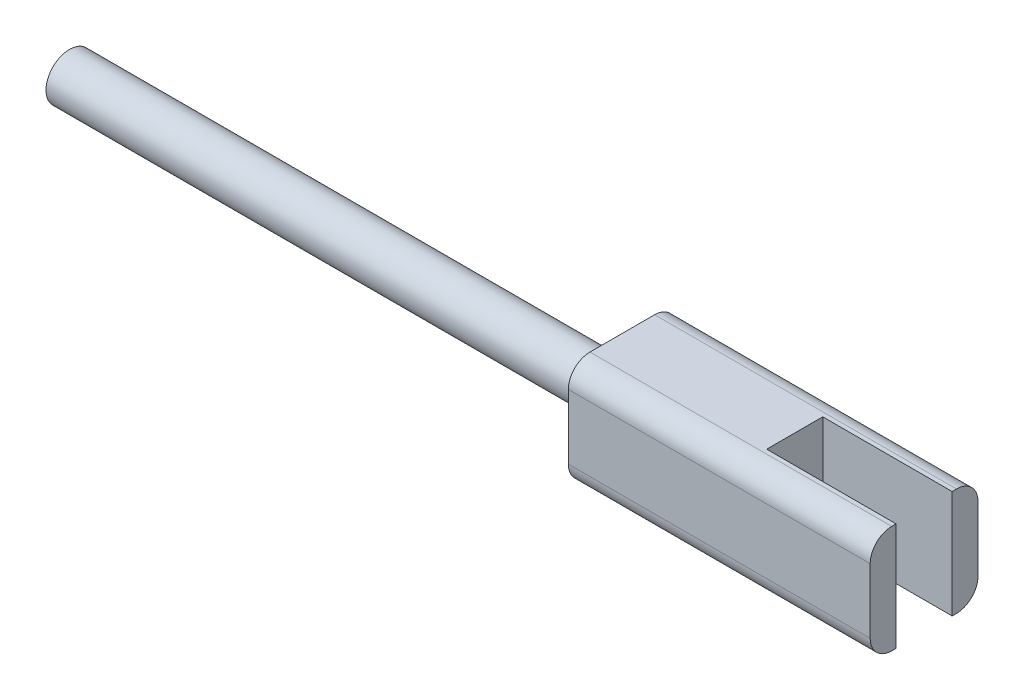
ISO-10303-21;
HEADER;
FILE_DESCRIPTION(('STEP AP214'),'2;1');
FILE_NAME('part.step','',(''),(''),'','','');
FILE_SCHEMA(('AUTOMOTIVE_DESIGN { 1 0 10303 214 1 1 1 1 }'));
ENDSEC;
DATA;
#1=APPLICATION_CONTEXT('core data for automotive mechanical design processes');
#2=APPLICATION_PROTOCOL_DEFINITION('international standard','automotive_design',2000,#1);
#3=PRODUCT_CONTEXT('',#1,'mechanical');
#4=PRODUCT('Part','Part','',(#3));
#5=PRODUCT_RELATED_PRODUCT_CATEGORY('part','',(#4));
#6=PRODUCT_DEFINITION_FORMATION('','',#4);
#7=PRODUCT_DEFINITION_CONTEXT('part definition',#1,'design');
#8=PRODUCT_DEFINITION('design','',#6,#7);
#9=PRODUCT_DEFINITION_SHAPE('','',#8);
#10=(LENGTH_UNIT() NAMED_UNIT(*) SI_UNIT(.MILLI.,.METRE.));
#11=(NAMED_UNIT(*) PLANE_ANGLE_UNIT() SI_UNIT($,.RADIAN.));
#12=(NAMED_UNIT(*) SI_UNIT($,.STERADIAN.) SOLID_ANGLE_UNIT());
#13=UNCERTAINTY_MEASURE_WITH_UNIT(LENGTH_MEASURE(1.E-05),#10,'distance_accuracy_value','');
#14=(GEOMETRIC_REPRESENTATION_CONTEXT(3) GLOBAL_UNCERTAINTY_ASSIGNED_CONTEXT((#13)) GLOBAL_UNIT_ASSIGNED_CONTEXT((#10,
#11,#12)) REPRESENTATION_CONTEXT('',''));
#15=CARTESIAN_POINT('',(0.,0.,0.));
#16=DIRECTION('',(0.,0.,1.));
#17=DIRECTION('',(1.,0.,0.));
#18=AXIS2_PLACEMENT_3D('',#15,#16,#17);
#19=CARTESIAN_POINT('',(39.637,-1.5,1.5));
#20=DIRECTION('',(1.,0.,0.));
#21=DIRECTION('',(0.,0.,-1.));
#22=AXIS2_PLACEMENT_3D('',#19,#20,#21);
#23=PLANE('',#22);
#24=DIRECTION('',(0.,1.,0.));
#25=VECTOR('',#24,1.);
#26=CARTESIAN_POINT('',(39.637,-1.5,-1.3));
#27=LINE('',#26,#25);
#28=CARTESIAN_POINT('',(39.637,-2.5,-1.3));
#29=VERTEX_POINT('',#28);
#30=CARTESIAN_POINT('',(39.637,2.5,-1.3));
#31=VERTEX_POINT('',#30);
#32=EDGE_CURVE('E11',#29,#31,#27,.T.);
#33=ORIENTED_EDGE('',*,*,#32,.F.);
#34=DIRECTION('',(0.,0.,-1.));
#35=VECTOR('',#34,1.);
#36=CARTESIAN_POINT('',(39.637,-2.5,1.5));
#37=LINE('',#36,#35);
#38=CARTESIAN_POINT('',(39.637,-2.5,-1.5));
#39=VERTEX_POINT('',#38);
#40=EDGE_CURVE('E202',#29,#39,#37,.T.);
#41=ORIENTED_EDGE('',*,*,#40,.T.);
#42=CARTESIAN_POINT('',(39.637,-1.5,-1.5));
#43=DIRECTION('',(1.,0.,0.));
#44=DIRECTION('',(0.,0.,-1.));
#45=AXIS2_PLACEMENT_3D('',#42,#43,#44);
#46=CIRCLE('',#45,1.);
#47=CARTESIAN_POINT('',(39.637,-1.5,-2.5));
#48=VERTEX_POINT('',#47);
#49=EDGE_CURVE('E201',#39,#48,#46,.T.);
#50=ORIENTED_EDGE('',*,*,#49,.T.);
#51=DIRECTION('',(0.,1.,0.));
#52=VECTOR('',#51,1.);
#53=CARTESIAN_POINT('',(39.637,-1.5,-2.5));
#54=LINE('',#53,#52);
#55=CARTESIAN_POINT('',(39.637,1.5,-2.5));
#56=VERTEX_POINT('',#55);
#57=EDGE_CURVE('E204',#48,#56,#54,.T.);
#58=ORIENTED_EDGE('',*,*,#57,.T.);
#59=CARTESIAN_POINT('',(39.637,1.5,-1.5));
#60=DIRECTION('',(1.,0.,0.));
#61=DIRECTION('',(0.,0.,-1.));
#62=AXIS2_PLACEMENT_3D('',#59,#60,#61);
#63=CIRCLE('',#62,1.);
#64=CARTESIAN_POINT('',(39.637,2.5,-1.5));
#65=VERTEX_POINT('',#64);
#66=EDGE_CURVE('E129',#56,#65,#63,.T.);
#67=ORIENTED_EDGE('',*,*,#66,.T.);
#68=DIRECTION('',(0.,0.,1.));
#69=VECTOR('',#68,1.);
#70=CARTESIAN_POINT('',(39.637,2.5,-1.5));
#71=LINE('',#70,#69);
#72=EDGE_CURVE('E128',#65,#31,#71,.T.);
#73=ORIENTED_EDGE('',*,*,#72,.T.);
#74=EDGE_LOOP('',(#33,#41,#50,#58,#67,#73));
#75=FACE_BOUND('',#74,.T.);
#76=ADVANCED_FACE('F39',(#75),#23,.T.);
#77=CARTESIAN_POINT('',(27.637,0.,0.));
#78=DIRECTION('',(-1.,0.,0.));
#79=DIRECTION('',(0.,0.,1.));
#80=AXIS2_PLACEMENT_3D('',#77,#78,#79);
#81=CYLINDRICAL_SURFACE('',#80,1.09);
#82=CARTESIAN_POINT('',(0.,0.,0.));
#83=DIRECTION('',(1.,0.,0.));
#84=DIRECTION('',(0.,0.,-1.));
#85=AXIS2_PLACEMENT_3D('',#82,#83,#84);
#86=CIRCLE('',#85,1.09);
#87=CARTESIAN_POINT('',(0.,0.,1.09));
#88=VERTEX_POINT('',#87);
#89=EDGE_CURVE('E181',#88,#88,#86,.T.);
#90=CARTESIAN_POINT('',(25.637,0.,0.));
#91=DIRECTION('',(1.,0.,0.));
#92=DIRECTION('',(0.,0.,-1.));
#93=AXIS2_PLACEMENT_3D('',#90,#91,#92);
#94=CIRCLE('',#93,1.09);
#95=CARTESIAN_POINT('',(25.637,0.,1.09));
#96=VERTEX_POINT('',#95);
#97=EDGE_CURVE('E184',#96,#96,#94,.T.);
#98=CARTESIAN_POINT('',(0.,0.,1.09));
#99=CARTESIAN_POINT('',(0.267052083333334,0.,1.09));
#100=CARTESIAN_POINT('',(0.534104166666667,0.,1.09));
#101=CARTESIAN_POINT('',(1.06820833333333,0.,1.09));
#102=CARTESIAN_POINT('',(1.33526041666667,0.,1.09));
#103=CARTESIAN_POINT('',(1.86936458333333,0.,1.09));
#104=CARTESIAN_POINT('',(2.13641666666667,0.,1.09));
#105=CARTESIAN_POINT('',(2.67052083333333,0.,1.09));
#106=CARTESIAN_POINT('',(2.93757291666667,0.,1.09));
#107=CARTESIAN_POINT('',(3.47167708333333,0.,1.09));
#108=CARTESIAN_POINT('',(3.73872916666667,0.,1.09));
#109=CARTESIAN_POINT('',(4.27283333333333,0.,1.09));
#110=CARTESIAN_POINT('',(4.53988541666667,0.,1.09));
#111=CARTESIAN_POINT('',(5.07398958333333,0.,1.09));
#112=CARTESIAN_POINT('',(5.34104166666667,0.,1.09));
#113=CARTESIAN_POINT('',(5.87514583333333,0.,1.09));
#114=CARTESIAN_POINT('',(6.14219791666667,0.,1.09));
#115=CARTESIAN_POINT('',(6.67630208333333,0.,1.09));
#116=CARTESIAN_POINT('',(6.94335416666667,0.,1.09));
#117=CARTESIAN_POINT('',(7.47745833333333,0.,1.09));
#118=CARTESIAN_POINT('',(7.74451041666667,0.,1.09));
#119=CARTESIAN_POINT('',(8.27861458333333,0.,1.09));
#120=CARTESIAN_POINT('',(8.54566666666667,0.,1.09));
#121=CARTESIAN_POINT('',(9.07977083333333,0.,1.09));
#122=CARTESIAN_POINT('',(9.34682291666667,0.,1.09));
#123=CARTESIAN_POINT('',(9.88092708333333,0.,1.09));
#124=CARTESIAN_POINT('',(10.1479791666667,0.,1.09));
#125=CARTESIAN_POINT('',(10.6820833333333,0.,1.09));
#126=CARTESIAN_POINT('',(10.9491354166667,0.,1.09));
#127=CARTESIAN_POINT('',(11.4832395833333,0.,1.09));
#128=CARTESIAN_POINT('',(11.7502916666667,0.,1.09));
#129=CARTESIAN_POINT('',(12.2843958333333,0.,1.09));
#130=CARTESIAN_POINT('',(12.5514479166667,0.,1.09));
#131=CARTESIAN_POINT('',(13.0855520833333,0.,1.09));
#132=CARTESIAN_POINT('',(13.3526041666667,0.,1.09));
#133=CARTESIAN_POINT('',(13.8867083333333,0.,1.09));
#134=CARTESIAN_POINT('',(14.1537604166667,0.,1.09));
#135=CARTESIAN_POINT('',(14.6878645833333,0.,1.09));
#136=CARTESIAN_POINT('',(14.9549166666667,0.,1.09));
#137=CARTESIAN_POINT('',(15.4890208333333,0.,1.09));
#138=CARTESIAN_POINT('',(15.7560729166667,0.,1.09));
#139=CARTESIAN_POINT('',(16.2901770833333,0.,1.09));
#140=CARTESIAN_POINT('',(16.5572291666667,0.,1.09));
#141=CARTESIAN_POINT('',(17.0913333333333,0.,1.09));
#142=CARTESIAN_POINT('',(17.3583854166667,0.,1.09));
#143=CARTESIAN_POINT('',(17.8924895833333,0.,1.09));
#144=CARTESIAN_POINT('',(18.1595416666667,0.,1.09));
#145=CARTESIAN_POINT('',(18.6936458333333,0.,1.09));
#146=CARTESIAN_POINT('',(18.9606979166667,0.,1.09));
#147=CARTESIAN_POINT('',(19.4948020833333,0.,1.09));
#148=CARTESIAN_POINT('',(19.7618541666667,0.,1.09));
#149=CARTESIAN_POINT('',(20.2959583333333,0.,1.09));
#150=CARTESIAN_POINT('',(20.5630104166667,0.,1.09));
#151=CARTESIAN_POINT('',(21.0971145833333,0.,1.09));
#152=CARTESIAN_POINT('',(21.3641666666667,0.,1.09));
#153=CARTESIAN_POINT('',(21.8982708333333,0.,1.09));
#154=CARTESIAN_POINT('',(22.1653229166667,0.,1.09));
#155=CARTESIAN_POINT('',(22.6994270833333,0.,1.09));
#156=CARTESIAN_POINT('',(22.9664791666667,0.,1.09));
#157=CARTESIAN_POINT('',(23.5005833333333,0.,1.09));
#158=CARTESIAN_POINT('',(23.7676354166667,0.,1.09));
#159=CARTESIAN_POINT('',(24.3017395833333,0.,1.09));
#160=CARTESIAN_POINT('',(24.5687916666667,0.,1.09));
#161=CARTESIAN_POINT('',(25.1028958333333,0.,1.09));
#162=CARTESIAN_POINT('',(25.3699479166667,0.,1.09));
#163=CARTESIAN_POINT('',(25.637,0.,1.09));
#164=B_SPLINE_CURVE_WITH_KNOTS('',3,(#98,#99,#100,#101,#102,#103,#104,#105,#106,#107,#108,#109,
#110,#111,#112,#113,#114,#115,#116,#117,#118,#119,#120,#121,#122,#123,#124,#125,#126,#127,#128,
#129,#130,#131,#132,#133,#134,#135,#136,#137,#138,#139,#140,#141,#142,#143,#144,#145,#146,#147,
#148,#149,#150,#151,#152,#153,#154,#155,#156,#157,#158,#159,#160,#161,#162,#163),.UNSPECIFIED.,
.F.,.F.,(4,2,2,2,2,2,2,2,2,2,2,2,2,2,2,2,2,2,2,2,2,2,2,2,2,2,2,2,2,2,2,2,4),(0.,
0.801156250000001,1.6023125,2.40346875,3.204625,4.00578125,4.8069375,5.60809375,6.40925,
7.21040625,8.0115625,8.81271875,9.613875,10.41503125,11.2161875,12.01734375,12.8185,13.61965625,
14.4208125,15.22196875,16.023125,16.82428125,17.6254375,18.42659375,19.22775,20.02890625,
20.8300625,21.63121875,22.432375,23.23353125,24.0346875,24.83584375,25.637),.UNSPECIFIED.);
#165=EDGE_CURVE('BSEAM41',#88,#96,#164,.T.);
#166=ORIENTED_EDGE('',*,*,#89,.T.);
#167=ORIENTED_EDGE('',*,*,#97,.F.);
#168=ORIENTED_EDGE('',*,*,#165,.T.);
#169=ORIENTED_EDGE('',*,*,#165,.F.);
#170=EDGE_LOOP('',(#166,#168,#167,#169));
#171=FACE_BOUND('',#170,.T.);
#172=ADVANCED_FACE('F41',(#171),#81,.T.);
#173=CARTESIAN_POINT('',(0.,0.,0.));
#174=DIRECTION('',(1.,0.,0.));
#175=DIRECTION('',(0.,0.,-1.));
#176=AXIS2_PLACEMENT_3D('',#173,#174,#175);
#177=PLANE('',#176);
#178=ORIENTED_EDGE('',*,*,#89,.F.);
#179=EDGE_LOOP('',(#178));
#180=FACE_BOUND('',#179,.T.);
#181=ADVANCED_FACE('F264',(#180),#177,.F.);
#182=CARTESIAN_POINT('',(39.637,-1.5,1.5));
#183=DIRECTION('',(-1.,0.,0.));
#184=DIRECTION('',(0.,0.,1.));
#185=AXIS2_PLACEMENT_3D('',#182,#183,#184);
#186=CYLINDRICAL_SURFACE('',#185,1.);
#187=CARTESIAN_POINT('',(25.637,-1.5,1.5));
#188=DIRECTION('',(1.,0.,0.));
#189=DIRECTION('',(0.,0.,-1.));
#190=AXIS2_PLACEMENT_3D('',#187,#188,#189);
#191=CIRCLE('',#190,1.);
#192=CARTESIAN_POINT('',(25.637,-1.5,2.5));
#193=VERTEX_POINT('',#192);
#194=CARTESIAN_POINT('',(25.637,-2.5,1.5));
#195=VERTEX_POINT('',#194);
#196=EDGE_CURVE('E150',#193,#195,#191,.T.);
#197=ORIENTED_EDGE('',*,*,#196,.T.);
#198=DIRECTION('',(-1.,0.,0.));
#199=VECTOR('',#198,1.);
#200=CARTESIAN_POINT('',(39.637,-2.5,1.5));
#201=LINE('',#200,#199);
#202=CARTESIAN_POINT('',(39.637,-2.5,1.5));
#203=VERTEX_POINT('',#202);
#204=EDGE_CURVE('E179',#203,#195,#201,.T.);
#205=ORIENTED_EDGE('',*,*,#204,.F.);
#206=CARTESIAN_POINT('',(39.637,-1.5,1.5));
#207=DIRECTION('',(1.,0.,0.));
#208=DIRECTION('',(0.,0.,-1.));
#209=AXIS2_PLACEMENT_3D('',#206,#207,#208);
#210=CIRCLE('',#209,1.);
#211=CARTESIAN_POINT('',(39.637,-1.5,2.5));
#212=VERTEX_POINT('',#211);
#213=EDGE_CURVE('E166',#212,#203,#210,.T.);
#214=ORIENTED_EDGE('',*,*,#213,.F.);
#215=DIRECTION('',(-1.,0.,0.));
#216=VECTOR('',#215,1.);
#217=CARTESIAN_POINT('',(39.637,-1.5,2.5));
#218=LINE('',#217,#216);
#219=EDGE_CURVE('E145',#212,#193,#218,.T.);
#220=ORIENTED_EDGE('',*,*,#219,.T.);
#221=EDGE_LOOP('',(#197,#205,#214,#220));
#222=FACE_BOUND('',#221,.T.);
#223=ADVANCED_FACE('F262',(#222),#186,.T.);
#224=CARTESIAN_POINT('',(39.637,-2.5,1.5));
#225=DIRECTION('',(0.,1.,0.));
#226=DIRECTION('',(0.,0.,1.));
#227=AXIS2_PLACEMENT_3D('',#224,#225,#226);
#228=PLANE('',#227);
#229=ORIENTED_EDGE('',*,*,#40,.F.);
#230=DIRECTION('',(-1.,0.,0.));
#231=VECTOR('',#230,1.);
#232=CARTESIAN_POINT('',(33.637,-2.5,-1.3));
#233=LINE('',#232,#231);
#234=CARTESIAN_POINT('',(33.637,-2.5,-1.3));
#235=VERTEX_POINT('',#234);
#236=EDGE_CURVE('E197',#29,#235,#233,.T.);
#237=ORIENTED_EDGE('',*,*,#236,.T.);
#238=DIRECTION('',(0.,0.,1.));
#239=VECTOR('',#238,1.);
#240=CARTESIAN_POINT('',(33.637,-2.5,1.3));
#241=LINE('',#240,#239);
#242=CARTESIAN_POINT('',(33.637,-2.5,1.3));
#243=VERTEX_POINT('',#242);
#244=EDGE_CURVE('E196',#235,#243,#241,.T.);
#245=ORIENTED_EDGE('',*,*,#244,.T.);
#246=DIRECTION('',(1.,0.,0.));
#247=VECTOR('',#246,1.);
#248=CARTESIAN_POINT('',(40.637,-2.5,1.3));
#249=LINE('',#248,#247);
#250=CARTESIAN_POINT('',(39.637,-2.5,1.3));
#251=VERTEX_POINT('',#250);
#252=EDGE_CURVE('E189',#243,#251,#249,.T.);
#253=ORIENTED_EDGE('',*,*,#252,.T.);
#254=EDGE_CURVE('E105',#203,#251,#37,.T.);
#255=ORIENTED_EDGE('',*,*,#254,.F.);
#256=ORIENTED_EDGE('',*,*,#204,.T.);
#257=DIRECTION('',(0.,0.,-1.));
#258=VECTOR('',#257,1.);
#259=CARTESIAN_POINT('',(25.637,-2.5,1.5));
#260=LINE('',#259,#258);
#261=CARTESIAN_POINT('',(25.637,-2.5,-1.5));
#262=VERTEX_POINT('',#261);
#263=EDGE_CURVE('E153',#195,#262,#260,.T.);
#264=ORIENTED_EDGE('',*,*,#263,.T.);
#265=DIRECTION('',(-1.,0.,0.));
#266=VECTOR('',#265,1.);
#267=CARTESIAN_POINT('',(39.637,-2.5,-1.5));
#268=LINE('',#267,#266);
#269=EDGE_CURVE('E176',#39,#262,#268,.T.);
#270=ORIENTED_EDGE('',*,*,#269,.F.);
#271=EDGE_LOOP('',(#229,#237,#245,#253,#255,#256,#264,#270));
#272=FACE_BOUND('',#271,.T.);
#273=ADVANCED_FACE('F193',(#272),#228,.F.);
#274=CARTESIAN_POINT('',(39.637,-1.5,-1.5));
#275=DIRECTION('',(-1.,0.,0.));
#276=DIRECTION('',(0.,0.,1.));
#277=AXIS2_PLACEMENT_3D('',#274,#275,#276);
#278=CYLINDRICAL_SURFACE('',#277,1.);
#279=CARTESIAN_POINT('',(25.637,-1.5,-1.5));
#280=DIRECTION('',(1.,0.,0.));
#281=DIRECTION('',(0.,0.,-1.));
#282=AXIS2_PLACEMENT_3D('',#279,#280,#281);
#283=CIRCLE('',#282,1.);
#284=CARTESIAN_POINT('',(25.637,-1.5,-2.5));
#285=VERTEX_POINT('',#284);
#286=EDGE_CURVE('E156',#262,#285,#283,.T.);
#287=ORIENTED_EDGE('',*,*,#286,.T.);
#288=DIRECTION('',(-1.,0.,0.));
#289=VECTOR('',#288,1.);
#290=CARTESIAN_POINT('',(39.637,-1.5,-2.5));
#291=LINE('',#290,#289);
#292=EDGE_CURVE('E173',#48,#285,#291,.T.);
#293=ORIENTED_EDGE('',*,*,#292,.F.);
#294=ORIENTED_EDGE('',*,*,#49,.F.);
#295=ORIENTED_EDGE('',*,*,#269,.T.);
#296=EDGE_LOOP('',(#287,#293,#294,#295));
#297=FACE_BOUND('',#296,.T.);
#298=ADVANCED_FACE('F253',(#297),#278,.T.);
#299=CARTESIAN_POINT('',(39.637,-1.5,-2.5));
#300=DIRECTION('',(0.,0.,1.));
#301=DIRECTION('',(1.,0.,0.));
#302=AXIS2_PLACEMENT_3D('',#299,#300,#301);
#303=PLANE('',#302);
#304=DIRECTION('',(0.,1.,0.));
#305=VECTOR('',#304,1.);
#306=CARTESIAN_POINT('',(25.637,-1.5,-2.5));
#307=LINE('',#306,#305);
#308=CARTESIAN_POINT('',(25.637,1.5,-2.5));
#309=VERTEX_POINT('',#308);
#310=EDGE_CURVE('E158',#285,#309,#307,.T.);
#311=ORIENTED_EDGE('',*,*,#310,.T.);
#312=DIRECTION('',(-1.,0.,0.));
#313=VECTOR('',#312,1.);
#314=CARTESIAN_POINT('',(39.637,1.5,-2.5));
#315=LINE('',#314,#313);
#316=EDGE_CURVE('E170',#56,#309,#315,.T.);
#317=ORIENTED_EDGE('',*,*,#316,.F.);
#318=ORIENTED_EDGE('',*,*,#57,.F.);
#319=ORIENTED_EDGE('',*,*,#292,.T.);
#320=EDGE_LOOP('',(#311,#317,#318,#319));
#321=FACE_BOUND('',#320,.T.);
#322=ADVANCED_FACE('F256',(#321),#303,.F.);
#323=CARTESIAN_POINT('',(39.637,1.5,-1.5));
#324=DIRECTION('',(-1.,0.,0.));
#325=DIRECTION('',(0.,0.,1.));
#326=AXIS2_PLACEMENT_3D('',#323,#324,#325);
#327=CYLINDRICAL_SURFACE('',#326,1.);
#328=CARTESIAN_POINT('',(25.637,1.5,-1.5));
#329=DIRECTION('',(1.,0.,0.));
#330=DIRECTION('',(0.,0.,-1.));
#331=AXIS2_PLACEMENT_3D('',#328,#329,#330);
#332=CIRCLE('',#331,1.);
#333=CARTESIAN_POINT('',(25.637,2.5,-1.5));
#334=VERTEX_POINT('',#333);
#335=EDGE_CURVE('E160',#309,#334,#332,.T.);
#336=ORIENTED_EDGE('',*,*,#335,.T.);
#337=DIRECTION('',(-1.,0.,0.));
#338=VECTOR('',#337,1.);
#339=CARTESIAN_POINT('',(39.637,2.5,-1.5));
#340=LINE('',#339,#338);
#341=EDGE_CURVE('E140',#65,#334,#340,.T.);
#342=ORIENTED_EDGE('',*,*,#341,.F.);
#343=ORIENTED_EDGE('',*,*,#66,.F.);
#344=ORIENTED_EDGE('',*,*,#316,.T.);
#345=EDGE_LOOP('',(#336,#342,#343,#344));
#346=FACE_BOUND('',#345,.T.);
#347=ADVANCED_FACE('F218',(#346),#327,.T.);
#348=CARTESIAN_POINT('',(39.637,2.5,-1.5));
#349=DIRECTION('',(0.,-1.,0.));
#350=DIRECTION('',(0.,0.,-1.));
#351=AXIS2_PLACEMENT_3D('',#348,#349,#350);
#352=PLANE('',#351);
#353=DIRECTION('',(0.,0.,1.));
#354=VECTOR('',#353,1.);
#355=CARTESIAN_POINT('',(33.637,2.5,1.3));
#356=LINE('',#355,#354);
#357=CARTESIAN_POINT('',(33.637,2.5,-1.3));
#358=VERTEX_POINT('',#357);
#359=CARTESIAN_POINT('',(33.637,2.5,1.3));
#360=VERTEX_POINT('',#359);
#361=EDGE_CURVE('E225',#358,#360,#356,.T.);
#362=ORIENTED_EDGE('',*,*,#361,.F.);
#363=DIRECTION('',(-1.,0.,0.));
#364=VECTOR('',#363,1.);
#365=CARTESIAN_POINT('',(33.637,2.5,-1.3));
#366=LINE('',#365,#364);
#367=EDGE_CURVE('E222',#31,#358,#366,.T.);
#368=ORIENTED_EDGE('',*,*,#367,.F.);
#369=ORIENTED_EDGE('',*,*,#72,.F.);
#370=ORIENTED_EDGE('',*,*,#341,.T.);
#371=DIRECTION('',(0.,0.,1.));
#372=VECTOR('',#371,1.);
#373=CARTESIAN_POINT('',(25.637,2.5,-1.5));
#374=LINE('',#373,#372);
#375=CARTESIAN_POINT('',(25.637,2.5,1.5));
#376=VERTEX_POINT('',#375);
#377=EDGE_CURVE('E137',#334,#376,#374,.T.);
#378=ORIENTED_EDGE('',*,*,#377,.T.);
#379=DIRECTION('',(-1.,0.,0.));
#380=VECTOR('',#379,1.);
#381=CARTESIAN_POINT('',(39.637,2.5,1.5));
#382=LINE('',#381,#380);
#383=CARTESIAN_POINT('',(39.637,2.5,1.5));
#384=VERTEX_POINT('',#383);
#385=EDGE_CURVE('E132',#384,#376,#382,.T.);
#386=ORIENTED_EDGE('',*,*,#385,.F.);
#387=CARTESIAN_POINT('',(39.637,2.5,1.3));
#388=VERTEX_POINT('',#387);
#389=EDGE_CURVE('E121',#388,#384,#71,.T.);
#390=ORIENTED_EDGE('',*,*,#389,.F.);
#391=DIRECTION('',(1.,0.,0.));
#392=VECTOR('',#391,1.);
#393=CARTESIAN_POINT('',(40.637,2.5,1.3));
#394=LINE('',#393,#392);
#395=EDGE_CURVE('E54',#360,#388,#394,.T.);
#396=ORIENTED_EDGE('',*,*,#395,.F.);
#397=EDGE_LOOP('',(#362,#368,#369,#370,#378,#386,#390,#396));
#398=FACE_BOUND('',#397,.T.);
#399=ADVANCED_FACE('F134',(#398),#352,.F.);
#400=CARTESIAN_POINT('',(39.637,1.5,1.5));
#401=DIRECTION('',(-1.,0.,0.));
#402=DIRECTION('',(0.,0.,1.));
#403=AXIS2_PLACEMENT_3D('',#400,#401,#402);
#404=CYLINDRICAL_SURFACE('',#403,1.);
#405=CARTESIAN_POINT('',(25.637,1.5,1.5));
#406=DIRECTION('',(1.,0.,0.));
#407=DIRECTION('',(0.,0.,-1.));
#408=AXIS2_PLACEMENT_3D('',#405,#406,#407);
#409=CIRCLE('',#408,1.);
#410=CARTESIAN_POINT('',(25.637,1.5,2.5));
#411=VERTEX_POINT('',#410);
#412=EDGE_CURVE('E163',#376,#411,#409,.T.);
#413=ORIENTED_EDGE('',*,*,#412,.T.);
#414=DIRECTION('',(-1.,0.,0.));
#415=VECTOR('',#414,1.);
#416=CARTESIAN_POINT('',(39.637,1.5,2.5));
#417=LINE('',#416,#415);
#418=CARTESIAN_POINT('',(39.637,1.5,2.5));
#419=VERTEX_POINT('',#418);
#420=EDGE_CURVE('E141',#419,#411,#417,.T.);
#421=ORIENTED_EDGE('',*,*,#420,.F.);
#422=CARTESIAN_POINT('',(39.637,1.5,1.5));
#423=DIRECTION('',(1.,0.,0.));
#424=DIRECTION('',(0.,0.,-1.));
#425=AXIS2_PLACEMENT_3D('',#422,#423,#424);
#426=CIRCLE('',#425,1.);
#427=EDGE_CURVE('E125',#384,#419,#426,.T.);
#428=ORIENTED_EDGE('',*,*,#427,.F.);
#429=ORIENTED_EDGE('',*,*,#385,.T.);
#430=EDGE_LOOP('',(#413,#421,#428,#429));
#431=FACE_BOUND('',#430,.T.);
#432=ADVANCED_FACE('F143',(#431),#404,.T.);
#433=CARTESIAN_POINT('',(39.637,1.5,2.5));
#434=DIRECTION('',(0.,0.,-1.));
#435=DIRECTION('',(-1.,0.,0.));
#436=AXIS2_PLACEMENT_3D('',#433,#434,#435);
#437=PLANE('',#436);
#438=DIRECTION('',(0.,-1.,0.));
#439=VECTOR('',#438,1.);
#440=CARTESIAN_POINT('',(25.637,1.5,2.5));
#441=LINE('',#440,#439);
#442=EDGE_CURVE('E96',#411,#193,#441,.T.);
#443=ORIENTED_EDGE('',*,*,#442,.T.);
#444=ORIENTED_EDGE('',*,*,#219,.F.);
#445=DIRECTION('',(0.,-1.,0.));
#446=VECTOR('',#445,1.);
#447=CARTESIAN_POINT('',(39.637,1.5,2.5));
#448=LINE('',#447,#446);
#449=EDGE_CURVE('E63',#419,#212,#448,.T.);
#450=ORIENTED_EDGE('',*,*,#449,.F.);
#451=ORIENTED_EDGE('',*,*,#420,.T.);
#452=EDGE_LOOP('',(#443,#444,#450,#451));
#453=FACE_BOUND('',#452,.T.);
#454=ADVANCED_FACE('F260',(#453),#437,.F.);
#455=DIRECTION('',(0.,-1.,0.));
#456=VECTOR('',#455,1.);
#457=CARTESIAN_POINT('',(39.637,-1.5,1.3));
#458=LINE('',#457,#456);
#459=EDGE_CURVE('E47',#388,#251,#458,.T.);
#460=ORIENTED_EDGE('',*,*,#459,.F.);
#461=ORIENTED_EDGE('',*,*,#389,.T.);
#462=ORIENTED_EDGE('',*,*,#427,.T.);
#463=ORIENTED_EDGE('',*,*,#449,.T.);
#464=ORIENTED_EDGE('',*,*,#213,.T.);
#465=ORIENTED_EDGE('',*,*,#254,.T.);
#466=EDGE_LOOP('',(#460,#461,#462,#463,#464,#465));
#467=FACE_BOUND('',#466,.T.);
#468=ADVANCED_FACE('F123',(#467),#23,.T.);
#469=CARTESIAN_POINT('',(25.637,-1.5,1.5));
#470=DIRECTION('',(1.,0.,0.));
#471=DIRECTION('',(0.,0.,-1.));
#472=AXIS2_PLACEMENT_3D('',#469,#470,#471);
#473=PLANE('',#472);
#474=ORIENTED_EDGE('',*,*,#97,.T.);
#475=EDGE_LOOP('',(#474));
#476=FACE_BOUND('',#475,.T.);
#477=ORIENTED_EDGE('',*,*,#196,.F.);
#478=ORIENTED_EDGE('',*,*,#442,.F.);
#479=ORIENTED_EDGE('',*,*,#412,.F.);
#480=ORIENTED_EDGE('',*,*,#377,.F.);
#481=ORIENTED_EDGE('',*,*,#335,.F.);
#482=ORIENTED_EDGE('',*,*,#310,.F.);
#483=ORIENTED_EDGE('',*,*,#286,.F.);
#484=ORIENTED_EDGE('',*,*,#263,.F.);
#485=EDGE_LOOP('',(#477,#478,#479,#480,#481,#482,#483,#484));
#486=FACE_BOUND('',#485,.T.);
#487=ADVANCED_FACE('F259',(#476,#486),#473,.F.);
#488=CARTESIAN_POINT('',(33.637,-2.5,1.3));
#489=DIRECTION('',(-1.,0.,0.));
#490=DIRECTION('',(0.,0.,1.));
#491=AXIS2_PLACEMENT_3D('',#488,#489,#490);
#492=PLANE('',#491);
#493=DIRECTION('',(0.,1.,0.));
#494=VECTOR('',#493,1.);
#495=CARTESIAN_POINT('',(33.637,-2.5,1.3));
#496=LINE('',#495,#494);
#497=EDGE_CURVE('E237',#243,#360,#496,.T.);
#498=ORIENTED_EDGE('',*,*,#497,.F.);
#499=ORIENTED_EDGE('',*,*,#244,.F.);
#500=DIRECTION('',(0.,1.,0.));
#501=VECTOR('',#500,1.);
#502=CARTESIAN_POINT('',(33.637,-2.5,-1.3));
#503=LINE('',#502,#501);
#504=EDGE_CURVE('E154',#235,#358,#503,.T.);
#505=ORIENTED_EDGE('',*,*,#504,.T.);
#506=ORIENTED_EDGE('',*,*,#361,.T.);
#507=EDGE_LOOP('',(#498,#499,#505,#506));
#508=FACE_BOUND('',#507,.T.);
#509=ADVANCED_FACE('F242',(#508),#492,.F.);
#510=CARTESIAN_POINT('',(33.637,-2.5,-1.3));
#511=DIRECTION('',(0.,0.,-1.));
#512=DIRECTION('',(-1.,0.,0.));
#513=AXIS2_PLACEMENT_3D('',#510,#511,#512);
#514=PLANE('',#513);
#515=ORIENTED_EDGE('',*,*,#32,.T.);
#516=ORIENTED_EDGE('',*,*,#367,.T.);
#517=ORIENTED_EDGE('',*,*,#504,.F.);
#518=ORIENTED_EDGE('',*,*,#236,.F.);
#519=EDGE_LOOP('',(#515,#516,#517,#518));
#520=FACE_BOUND('',#519,.T.);
#521=ADVANCED_FACE('F245',(#520),#514,.F.);
#522=CARTESIAN_POINT('',(40.637,-2.5,1.3));
#523=DIRECTION('',(0.,0.,1.));
#524=DIRECTION('',(1.,0.,0.));
#525=AXIS2_PLACEMENT_3D('',#522,#523,#524);
#526=PLANE('',#525);
#527=ORIENTED_EDGE('',*,*,#459,.T.);
#528=ORIENTED_EDGE('',*,*,#252,.F.);
#529=ORIENTED_EDGE('',*,*,#497,.T.);
#530=ORIENTED_EDGE('',*,*,#395,.T.);
#531=EDGE_LOOP('',(#527,#528,#529,#530));
#532=FACE_BOUND('',#531,.T.);
#533=ADVANCED_FACE('F187',(#532),#526,.F.);
#534=CLOSED_SHELL('',(#76,#172,#181,#223,#273,#298,#322,#347,#399,#432,#454,#468,#487,#509,#521,#533));
#535=MANIFOLD_SOLID_BREP('B2',#534);
#536=ADVANCED_BREP_SHAPE_REPRESENTATION('',(#18,#535),#14);
#537=SHAPE_DEFINITION_REPRESENTATION(#9,#536);
ENDSEC;
END-ISO-10303-21;
